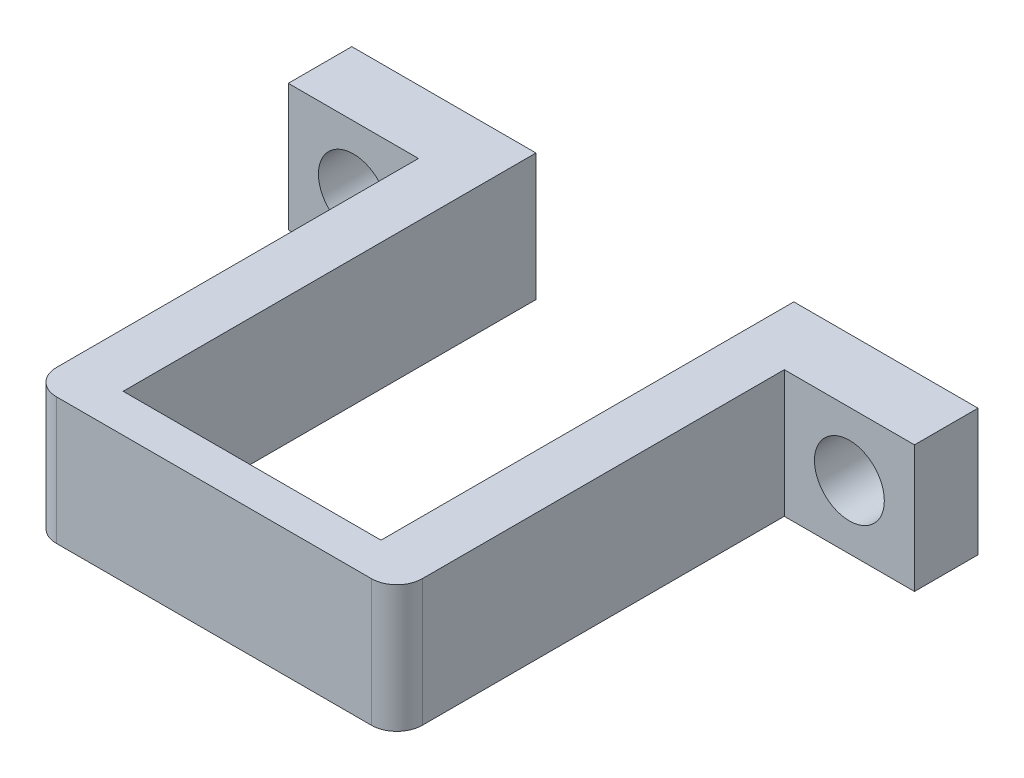
ISO-10303-21;
HEADER;
FILE_DESCRIPTION(('STEP AP214'),'2;1');
FILE_NAME('part.step','',(''),(''),'','','');
FILE_SCHEMA(('AUTOMOTIVE_DESIGN { 1 0 10303 214 1 1 1 1 }'));
ENDSEC;
DATA;
#1=APPLICATION_CONTEXT('core data for automotive mechanical design processes');
#2=APPLICATION_PROTOCOL_DEFINITION('international standard','automotive_design',2000,#1);
#3=PRODUCT_CONTEXT('',#1,'mechanical');
#4=PRODUCT('Part','Part','',(#3));
#5=PRODUCT_RELATED_PRODUCT_CATEGORY('part','',(#4));
#6=PRODUCT_DEFINITION_FORMATION('','',#4);
#7=PRODUCT_DEFINITION_CONTEXT('part definition',#1,'design');
#8=PRODUCT_DEFINITION('design','',#6,#7);
#9=PRODUCT_DEFINITION_SHAPE('','',#8);
#10=(LENGTH_UNIT() NAMED_UNIT(*) SI_UNIT(.MILLI.,.METRE.));
#11=(NAMED_UNIT(*) PLANE_ANGLE_UNIT() SI_UNIT($,.RADIAN.));
#12=(NAMED_UNIT(*) SI_UNIT($,.STERADIAN.) SOLID_ANGLE_UNIT());
#13=UNCERTAINTY_MEASURE_WITH_UNIT(LENGTH_MEASURE(1.E-05),#10,'distance_accuracy_value','');
#14=(GEOMETRIC_REPRESENTATION_CONTEXT(3) GLOBAL_UNCERTAINTY_ASSIGNED_CONTEXT((#13)) GLOBAL_UNIT_ASSIGNED_CONTEXT((#10,
#11,#12)) REPRESENTATION_CONTEXT('',''));
#15=CARTESIAN_POINT('',(0.,0.,0.));
#16=DIRECTION('',(0.,0.,1.));
#17=DIRECTION('',(1.,0.,0.));
#18=AXIS2_PLACEMENT_3D('',#15,#16,#17);
#19=CARTESIAN_POINT('',(-14.4,0.,35.5000000000006));
#20=DIRECTION('',(1.,0.,0.));
#21=DIRECTION('',(0.,0.,-1.));
#22=AXIS2_PLACEMENT_3D('',#19,#20,#21);
#23=PLANE('',#22);
#24=DIRECTION('',(0.,0.,-1.));
#25=VECTOR('',#24,1.);
#26=CARTESIAN_POINT('',(-14.4,-64.5,35.5000000000006));
#27=LINE('',#26,#25);
#28=CARTESIAN_POINT('',(-14.4,-64.5,33.5000000000006));
#29=VERTEX_POINT('',#28);
#30=CARTESIAN_POINT('',(-14.4,-64.5,5.));
#31=VERTEX_POINT('',#30);
#32=EDGE_CURVE('E225',#29,#31,#27,.T.);
#33=ORIENTED_EDGE('',*,*,#32,.F.);
#34=DIRECTION('',(0.,-1.,0.));
#35=VECTOR('',#34,1.);
#36=CARTESIAN_POINT('',(-14.4,-54.5,33.5000000000006));
#37=LINE('',#36,#35);
#38=CARTESIAN_POINT('',(-14.4,-54.5,33.5000000000006));
#39=VERTEX_POINT('',#38);
#40=EDGE_CURVE('E11',#29,#39,#37,.F.);
#41=ORIENTED_EDGE('',*,*,#40,.T.);
#42=DIRECTION('',(0.,0.,-1.));
#43=VECTOR('',#42,1.);
#44=CARTESIAN_POINT('',(-14.4,-54.5,35.5000000000006));
#45=LINE('',#44,#43);
#46=CARTESIAN_POINT('',(-14.4,-54.5,5.));
#47=VERTEX_POINT('',#46);
#48=EDGE_CURVE('E230',#39,#47,#45,.T.);
#49=ORIENTED_EDGE('',*,*,#48,.T.);
#50=DIRECTION('',(0.,1.,0.));
#51=VECTOR('',#50,1.);
#52=CARTESIAN_POINT('',(-14.4,-64.5,5.));
#53=LINE('',#52,#51);
#54=EDGE_CURVE('E180',#31,#47,#53,.T.);
#55=ORIENTED_EDGE('',*,*,#54,.F.);
#56=EDGE_LOOP('',(#33,#41,#49,#55));
#57=FACE_BOUND('',#56,.T.);
#58=ADVANCED_FACE('F35',(#57),#23,.F.);
#59=CARTESIAN_POINT('',(14.4,0.,43.365656906051));
#60=DIRECTION('',(-1.,0.,0.));
#61=DIRECTION('',(0.,0.,1.));
#62=AXIS2_PLACEMENT_3D('',#59,#60,#61);
#63=PLANE('',#62);
#64=DIRECTION('',(0.,0.,-1.));
#65=VECTOR('',#64,1.);
#66=CARTESIAN_POINT('',(14.4,-54.5,43.365656906051));
#67=LINE('',#66,#65);
#68=CARTESIAN_POINT('',(14.4,-54.5,33.5000000000006));
#69=VERTEX_POINT('',#68);
#70=CARTESIAN_POINT('',(14.4,-54.5,5.));
#71=VERTEX_POINT('',#70);
#72=EDGE_CURVE('E153',#69,#71,#67,.T.);
#73=ORIENTED_EDGE('',*,*,#72,.F.);
#74=DIRECTION('',(0.,1.,0.));
#75=VECTOR('',#74,1.);
#76=CARTESIAN_POINT('',(14.4,-64.5,33.5000000000006));
#77=LINE('',#76,#75);
#78=CARTESIAN_POINT('',(14.4,-64.5,33.5000000000006));
#79=VERTEX_POINT('',#78);
#80=EDGE_CURVE('E58',#69,#79,#77,.F.);
#81=ORIENTED_EDGE('',*,*,#80,.T.);
#82=DIRECTION('',(0.,0.,-1.));
#83=VECTOR('',#82,1.);
#84=CARTESIAN_POINT('',(14.4,-64.5,43.365656906051));
#85=LINE('',#84,#83);
#86=CARTESIAN_POINT('',(14.4,-64.5,5.));
#87=VERTEX_POINT('',#86);
#88=EDGE_CURVE('E244',#79,#87,#85,.T.);
#89=ORIENTED_EDGE('',*,*,#88,.T.);
#90=DIRECTION('',(0.,-1.,0.));
#91=VECTOR('',#90,1.);
#92=CARTESIAN_POINT('',(14.4,-54.5,5.));
#93=LINE('',#92,#91);
#94=EDGE_CURVE('E157',#71,#87,#93,.T.);
#95=ORIENTED_EDGE('',*,*,#94,.F.);
#96=EDGE_LOOP('',(#73,#81,#89,#95));
#97=FACE_BOUND('',#96,.T.);
#98=ADVANCED_FACE('F268',(#97),#63,.F.);
#99=CARTESIAN_POINT('',(0.,0.,32.5000000000006));
#100=DIRECTION('',(0.,0.,1.));
#101=DIRECTION('',(1.,0.,0.));
#102=AXIS2_PLACEMENT_3D('',#99,#100,#101);
#103=PLANE('',#102);
#104=DIRECTION('',(0.,-1.,0.));
#105=VECTOR('',#104,1.);
#106=CARTESIAN_POINT('',(-10.1499999999998,0.,32.5000000000006));
#107=LINE('',#106,#105);
#108=CARTESIAN_POINT('',(-10.1499999999998,-54.5,32.5000000000005));
#109=VERTEX_POINT('',#108);
#110=CARTESIAN_POINT('',(-10.1499999999998,-64.5,32.5000000000005));
#111=VERTEX_POINT('',#110);
#112=EDGE_CURVE('E204',#109,#111,#107,.T.);
#113=ORIENTED_EDGE('',*,*,#112,.F.);
#114=DIRECTION('',(-1.,0.,0.));
#115=VECTOR('',#114,1.);
#116=CARTESIAN_POINT('',(0.,-54.5,32.5000000000006));
#117=LINE('',#116,#115);
#118=CARTESIAN_POINT('',(10.1500000000002,-54.5,32.5000000000005));
#119=VERTEX_POINT('',#118);
#120=EDGE_CURVE('E222',#119,#109,#117,.T.);
#121=ORIENTED_EDGE('',*,*,#120,.F.);
#122=DIRECTION('',(0.,-1.,0.));
#123=VECTOR('',#122,1.);
#124=CARTESIAN_POINT('',(10.1500000000002,0.,32.5000000000006));
#125=LINE('',#124,#123);
#126=CARTESIAN_POINT('',(10.1500000000002,-64.5,32.5000000000006));
#127=VERTEX_POINT('',#126);
#128=EDGE_CURVE('E246',#119,#127,#125,.T.);
#129=ORIENTED_EDGE('',*,*,#128,.T.);
#130=DIRECTION('',(1.,0.,0.));
#131=VECTOR('',#130,1.);
#132=CARTESIAN_POINT('',(0.,-64.5,32.5000000000006));
#133=LINE('',#132,#131);
#134=EDGE_CURVE('E207',#111,#127,#133,.T.);
#135=ORIENTED_EDGE('',*,*,#134,.F.);
#136=EDGE_LOOP('',(#113,#121,#129,#135));
#137=FACE_BOUND('',#136,.T.);
#138=ADVANCED_FACE('F281',(#137),#103,.F.);
#139=CARTESIAN_POINT('',(0.,-64.5,43.365656906051));
#140=DIRECTION('',(0.,1.,0.));
#141=DIRECTION('',(0.,0.,1.));
#142=AXIS2_PLACEMENT_3D('',#139,#140,#141);
#143=PLANE('',#142);
#144=ORIENTED_EDGE('',*,*,#88,.F.);
#145=CARTESIAN_POINT('',(12.4,-64.5,33.5000000000006));
#146=DIRECTION('',(0.,1.,0.));
#147=DIRECTION('',(0.,0.,1.));
#148=AXIS2_PLACEMENT_3D('',#145,#146,#147);
#149=CIRCLE('',#148,2.);
#150=CARTESIAN_POINT('',(12.4,-64.5,35.5000000000006));
#151=VERTEX_POINT('',#150);
#152=EDGE_CURVE('E43',#79,#151,#149,.F.);
#153=ORIENTED_EDGE('',*,*,#152,.T.);
#154=DIRECTION('',(1.,0.,0.));
#155=VECTOR('',#154,1.);
#156=CARTESIAN_POINT('',(0.,-64.5,35.5000000000006));
#157=LINE('',#156,#155);
#158=CARTESIAN_POINT('',(-12.4,-64.5,35.5000000000006));
#159=VERTEX_POINT('',#158);
#160=EDGE_CURVE('E218',#159,#151,#157,.T.);
#161=ORIENTED_EDGE('',*,*,#160,.F.);
#162=CARTESIAN_POINT('',(-12.4,-64.5,33.5000000000006));
#163=DIRECTION('',(0.,1.,0.));
#164=DIRECTION('',(0.,0.,1.));
#165=AXIS2_PLACEMENT_3D('',#162,#163,#164);
#166=CIRCLE('',#165,2.);
#167=EDGE_CURVE('E50',#159,#29,#166,.F.);
#168=ORIENTED_EDGE('',*,*,#167,.T.);
#169=ORIENTED_EDGE('',*,*,#32,.T.);
#170=DIRECTION('',(1.,0.,0.));
#171=VECTOR('',#170,1.);
#172=CARTESIAN_POINT('',(-24.6499999999998,-64.5,5.));
#173=LINE('',#172,#171);
#174=CARTESIAN_POINT('',(-24.6499999999998,-64.5,5.));
#175=VERTEX_POINT('',#174);
#176=EDGE_CURVE('E177',#175,#31,#173,.T.);
#177=ORIENTED_EDGE('',*,*,#176,.F.);
#178=DIRECTION('',(0.,0.,-1.));
#179=VECTOR('',#178,1.);
#180=CARTESIAN_POINT('',(-24.6499999999998,-64.5,3.));
#181=LINE('',#180,#179);
#182=CARTESIAN_POINT('',(-24.6499999999998,-64.5,0.));
#183=VERTEX_POINT('',#182);
#184=EDGE_CURVE('E198',#175,#183,#181,.T.);
#185=ORIENTED_EDGE('',*,*,#184,.T.);
#186=DIRECTION('',(-1.,0.,0.));
#187=VECTOR('',#186,1.);
#188=CARTESIAN_POINT('',(0.,-64.5,0.));
#189=LINE('',#188,#187);
#190=CARTESIAN_POINT('',(-10.1499999999998,-64.5,0.));
#191=VERTEX_POINT('',#190);
#192=EDGE_CURVE('E201',#191,#183,#189,.T.);
#193=ORIENTED_EDGE('',*,*,#192,.F.);
#194=DIRECTION('',(0.,0.,-1.));
#195=VECTOR('',#194,1.);
#196=CARTESIAN_POINT('',(-10.1499999999998,-64.5,43.365656906051));
#197=LINE('',#196,#195);
#198=EDGE_CURVE('E208',#111,#191,#197,.T.);
#199=ORIENTED_EDGE('',*,*,#198,.F.);
#200=ORIENTED_EDGE('',*,*,#134,.T.);
#201=DIRECTION('',(0.,0.,-1.));
#202=VECTOR('',#201,1.);
#203=CARTESIAN_POINT('',(10.1500000000002,-64.5,43.365656906051));
#204=LINE('',#203,#202);
#205=CARTESIAN_POINT('',(10.1500000000002,-64.5,0.));
#206=VERTEX_POINT('',#205);
#207=EDGE_CURVE('E239',#127,#206,#204,.T.);
#208=ORIENTED_EDGE('',*,*,#207,.T.);
#209=DIRECTION('',(1.,0.,0.));
#210=VECTOR('',#209,1.);
#211=CARTESIAN_POINT('',(0.,-64.5,0.));
#212=LINE('',#211,#210);
#213=CARTESIAN_POINT('',(24.6500000000002,-64.5,0.));
#214=VERTEX_POINT('',#213);
#215=EDGE_CURVE('E232',#206,#214,#212,.T.);
#216=ORIENTED_EDGE('',*,*,#215,.T.);
#217=DIRECTION('',(0.,0.,-1.));
#218=VECTOR('',#217,1.);
#219=CARTESIAN_POINT('',(24.6500000000002,-64.5,3.));
#220=LINE('',#219,#218);
#221=CARTESIAN_POINT('',(24.6500000000002,-64.5,5.));
#222=VERTEX_POINT('',#221);
#223=EDGE_CURVE('E147',#222,#214,#220,.T.);
#224=ORIENTED_EDGE('',*,*,#223,.F.);
#225=DIRECTION('',(1.,0.,0.));
#226=VECTOR('',#225,1.);
#227=CARTESIAN_POINT('',(14.4,-64.5,5.));
#228=LINE('',#227,#226);
#229=EDGE_CURVE('E163',#87,#222,#228,.T.);
#230=ORIENTED_EDGE('',*,*,#229,.F.);
#231=EDGE_LOOP('',(#144,#153,#161,#168,#169,#177,#185,#193,#199,#200,#208,#216,#224,#230));
#232=FACE_BOUND('',#231,.T.);
#233=ADVANCED_FACE('F261',(#232),#143,.F.);
#234=CARTESIAN_POINT('',(0.,-54.5,43.365656906051));
#235=DIRECTION('',(0.,1.,0.));
#236=DIRECTION('',(0.,0.,1.));
#237=AXIS2_PLACEMENT_3D('',#234,#235,#236);
#238=PLANE('',#237);
#239=DIRECTION('',(-1.,0.,0.));
#240=VECTOR('',#239,1.);
#241=CARTESIAN_POINT('',(0.,-54.5,35.5000000000006));
#242=LINE('',#241,#240);
#243=CARTESIAN_POINT('',(12.4,-54.5,35.5000000000006));
#244=VERTEX_POINT('',#243);
#245=CARTESIAN_POINT('',(-12.4,-54.5,35.5000000000006));
#246=VERTEX_POINT('',#245);
#247=EDGE_CURVE('E221',#244,#246,#242,.T.);
#248=ORIENTED_EDGE('',*,*,#247,.F.);
#249=CARTESIAN_POINT('',(12.4,-54.5,33.5000000000006));
#250=DIRECTION('',(0.,1.,0.));
#251=DIRECTION('',(0.,0.,1.));
#252=AXIS2_PLACEMENT_3D('',#249,#250,#251);
#253=CIRCLE('',#252,2.);
#254=EDGE_CURVE('E257',#244,#69,#253,.T.);
#255=ORIENTED_EDGE('',*,*,#254,.T.);
#256=ORIENTED_EDGE('',*,*,#72,.T.);
#257=DIRECTION('',(-1.,0.,0.));
#258=VECTOR('',#257,1.);
#259=CARTESIAN_POINT('',(24.6500000000002,-54.5,5.));
#260=LINE('',#259,#258);
#261=CARTESIAN_POINT('',(24.6500000000002,-54.5,5.));
#262=VERTEX_POINT('',#261);
#263=EDGE_CURVE('E150',#262,#71,#260,.T.);
#264=ORIENTED_EDGE('',*,*,#263,.F.);
#265=DIRECTION('',(0.,0.,-1.));
#266=VECTOR('',#265,1.);
#267=CARTESIAN_POINT('',(24.6500000000002,-54.5,3.));
#268=LINE('',#267,#266);
#269=CARTESIAN_POINT('',(24.6500000000002,-54.5,0.));
#270=VERTEX_POINT('',#269);
#271=EDGE_CURVE('E137',#262,#270,#268,.T.);
#272=ORIENTED_EDGE('',*,*,#271,.T.);
#273=DIRECTION('',(1.,0.,0.));
#274=VECTOR('',#273,1.);
#275=CARTESIAN_POINT('',(0.,-54.5,0.));
#276=LINE('',#275,#274);
#277=CARTESIAN_POINT('',(10.1500000000002,-54.5,0.));
#278=VERTEX_POINT('',#277);
#279=EDGE_CURVE('E234',#278,#270,#276,.T.);
#280=ORIENTED_EDGE('',*,*,#279,.F.);
#281=DIRECTION('',(0.,0.,-1.));
#282=VECTOR('',#281,1.);
#283=CARTESIAN_POINT('',(10.1500000000002,-54.5,43.365656906051));
#284=LINE('',#283,#282);
#285=EDGE_CURVE('E241',#119,#278,#284,.T.);
#286=ORIENTED_EDGE('',*,*,#285,.F.);
#287=ORIENTED_EDGE('',*,*,#120,.T.);
#288=DIRECTION('',(0.,0.,-1.));
#289=VECTOR('',#288,1.);
#290=CARTESIAN_POINT('',(-10.1499999999998,-54.5,43.365656906051));
#291=LINE('',#290,#289);
#292=CARTESIAN_POINT('',(-10.1499999999998,-54.5,0.));
#293=VERTEX_POINT('',#292);
#294=EDGE_CURVE('E215',#109,#293,#291,.T.);
#295=ORIENTED_EDGE('',*,*,#294,.T.);
#296=DIRECTION('',(-1.,0.,0.));
#297=VECTOR('',#296,1.);
#298=CARTESIAN_POINT('',(0.,-54.5,0.));
#299=LINE('',#298,#297);
#300=CARTESIAN_POINT('',(-24.6499999999998,-54.5,0.));
#301=VERTEX_POINT('',#300);
#302=EDGE_CURVE('E213',#293,#301,#299,.T.);
#303=ORIENTED_EDGE('',*,*,#302,.T.);
#304=DIRECTION('',(0.,0.,-1.));
#305=VECTOR('',#304,1.);
#306=CARTESIAN_POINT('',(-24.6499999999998,-54.5,3.));
#307=LINE('',#306,#305);
#308=CARTESIAN_POINT('',(-24.6499999999998,-54.5,5.));
#309=VERTEX_POINT('',#308);
#310=EDGE_CURVE('E197',#309,#301,#307,.T.);
#311=ORIENTED_EDGE('',*,*,#310,.F.);
#312=DIRECTION('',(-1.,0.,0.));
#313=VECTOR('',#312,1.);
#314=CARTESIAN_POINT('',(-14.4,-54.5,5.));
#315=LINE('',#314,#313);
#316=EDGE_CURVE('E183',#47,#309,#315,.T.);
#317=ORIENTED_EDGE('',*,*,#316,.F.);
#318=ORIENTED_EDGE('',*,*,#48,.F.);
#319=CARTESIAN_POINT('',(-12.4,-54.5,33.5000000000006));
#320=DIRECTION('',(0.,1.,0.));
#321=DIRECTION('',(0.,0.,1.));
#322=AXIS2_PLACEMENT_3D('',#319,#320,#321);
#323=CIRCLE('',#322,2.);
#324=EDGE_CURVE('E255',#39,#246,#323,.T.);
#325=ORIENTED_EDGE('',*,*,#324,.T.);
#326=EDGE_LOOP('',(#248,#255,#256,#264,#272,#280,#286,#287,#295,#303,#311,#317,#318,#325));
#327=FACE_BOUND('',#326,.T.);
#328=ADVANCED_FACE('F152',(#327),#238,.T.);
#329=CARTESIAN_POINT('',(10.1500000000002,0.,43.365656906051));
#330=DIRECTION('',(-1.,0.,0.));
#331=DIRECTION('',(0.,0.,1.));
#332=AXIS2_PLACEMENT_3D('',#329,#330,#331);
#333=PLANE('',#332);
#334=DIRECTION('',(0.,1.,0.));
#335=VECTOR('',#334,1.);
#336=CARTESIAN_POINT('',(10.1500000000002,0.,0.));
#337=LINE('',#336,#335);
#338=EDGE_CURVE('E236',#206,#278,#337,.T.);
#339=ORIENTED_EDGE('',*,*,#338,.F.);
#340=ORIENTED_EDGE('',*,*,#207,.F.);
#341=ORIENTED_EDGE('',*,*,#128,.F.);
#342=ORIENTED_EDGE('',*,*,#285,.T.);
#343=EDGE_LOOP('',(#339,#340,#341,#342));
#344=FACE_BOUND('',#343,.T.);
#345=ADVANCED_FACE('F277',(#344),#333,.T.);
#346=CARTESIAN_POINT('',(0.,0.,0.));
#347=DIRECTION('',(0.,0.,1.));
#348=DIRECTION('',(1.,0.,0.));
#349=AXIS2_PLACEMENT_3D('',#346,#347,#348);
#350=PLANE('',#349);
#351=CARTESIAN_POINT('',(19.5250000000001,-59.5,0.));
#352=DIRECTION('',(0.,0.,-1.));
#353=DIRECTION('',(-1.,0.,0.));
#354=AXIS2_PLACEMENT_3D('',#351,#352,#353);
#355=CIRCLE('',#354,2.75);
#356=CARTESIAN_POINT('',(16.7750000000001,-59.5,0.));
#357=VERTEX_POINT('',#356);
#358=EDGE_CURVE('E186',#357,#357,#355,.T.);
#359=ORIENTED_EDGE('',*,*,#358,.F.);
#360=EDGE_LOOP('',(#359));
#361=FACE_BOUND('',#360,.T.);
#362=ORIENTED_EDGE('',*,*,#215,.F.);
#363=ORIENTED_EDGE('',*,*,#338,.T.);
#364=ORIENTED_EDGE('',*,*,#279,.T.);
#365=DIRECTION('',(0.,-1.,0.));
#366=VECTOR('',#365,1.);
#367=CARTESIAN_POINT('',(24.6500000000002,0.,0.));
#368=LINE('',#367,#366);
#369=EDGE_CURVE('E144',#270,#214,#368,.T.);
#370=ORIENTED_EDGE('',*,*,#369,.T.);
#371=EDGE_LOOP('',(#362,#363,#364,#370));
#372=FACE_BOUND('',#371,.T.);
#373=ADVANCED_FACE('F271',(#361,#372),#350,.F.);
#374=CARTESIAN_POINT('',(0.,0.,35.5000000000006));
#375=DIRECTION('',(0.,0.,1.));
#376=DIRECTION('',(1.,0.,0.));
#377=AXIS2_PLACEMENT_3D('',#374,#375,#376);
#378=PLANE('',#377);
#379=ORIENTED_EDGE('',*,*,#160,.T.);
#380=DIRECTION('',(0.,1.,0.));
#381=VECTOR('',#380,1.);
#382=CARTESIAN_POINT('',(12.4,-54.5,35.5000000000006));
#383=LINE('',#382,#381);
#384=EDGE_CURVE('E252',#151,#244,#383,.T.);
#385=ORIENTED_EDGE('',*,*,#384,.T.);
#386=ORIENTED_EDGE('',*,*,#247,.T.);
#387=DIRECTION('',(0.,-1.,0.));
#388=VECTOR('',#387,1.);
#389=CARTESIAN_POINT('',(-12.4,-64.5,35.5000000000006));
#390=LINE('',#389,#388);
#391=EDGE_CURVE('E249',#246,#159,#390,.T.);
#392=ORIENTED_EDGE('',*,*,#391,.T.);
#393=EDGE_LOOP('',(#379,#385,#386,#392));
#394=FACE_BOUND('',#393,.T.);
#395=ADVANCED_FACE('F265',(#394),#378,.T.);
#396=CARTESIAN_POINT('',(0.,0.,0.));
#397=DIRECTION('',(0.,0.,1.));
#398=DIRECTION('',(1.,0.,0.));
#399=AXIS2_PLACEMENT_3D('',#396,#397,#398);
#400=PLANE('',#399);
#401=CARTESIAN_POINT('',(-19.5249999999999,-59.5,0.));
#402=DIRECTION('',(0.,0.,-1.));
#403=DIRECTION('',(-1.,0.,0.));
#404=AXIS2_PLACEMENT_3D('',#401,#402,#403);
#405=CIRCLE('',#404,2.75);
#406=CARTESIAN_POINT('',(-22.2749999999999,-59.5,0.));
#407=VERTEX_POINT('',#406);
#408=EDGE_CURVE('E187',#407,#407,#405,.T.);
#409=ORIENTED_EDGE('',*,*,#408,.F.);
#410=EDGE_LOOP('',(#409));
#411=FACE_BOUND('',#410,.T.);
#412=ORIENTED_EDGE('',*,*,#192,.T.);
#413=DIRECTION('',(0.,-1.,0.));
#414=VECTOR('',#413,1.);
#415=CARTESIAN_POINT('',(-24.6499999999998,0.,0.));
#416=LINE('',#415,#414);
#417=EDGE_CURVE('E193',#301,#183,#416,.T.);
#418=ORIENTED_EDGE('',*,*,#417,.F.);
#419=ORIENTED_EDGE('',*,*,#302,.F.);
#420=DIRECTION('',(0.,1.,0.));
#421=VECTOR('',#420,1.);
#422=CARTESIAN_POINT('',(-10.1499999999998,0.,0.));
#423=LINE('',#422,#421);
#424=EDGE_CURVE('E210',#191,#293,#423,.T.);
#425=ORIENTED_EDGE('',*,*,#424,.F.);
#426=EDGE_LOOP('',(#412,#418,#419,#425));
#427=FACE_BOUND('',#426,.T.);
#428=ADVANCED_FACE('F292',(#411,#427),#400,.F.);
#429=CARTESIAN_POINT('',(-10.1499999999998,0.,43.365656906051));
#430=DIRECTION('',(-1.,0.,0.));
#431=DIRECTION('',(0.,0.,1.));
#432=AXIS2_PLACEMENT_3D('',#429,#430,#431);
#433=PLANE('',#432);
#434=ORIENTED_EDGE('',*,*,#424,.T.);
#435=ORIENTED_EDGE('',*,*,#294,.F.);
#436=ORIENTED_EDGE('',*,*,#112,.T.);
#437=ORIENTED_EDGE('',*,*,#198,.T.);
#438=EDGE_LOOP('',(#434,#435,#436,#437));
#439=FACE_BOUND('',#438,.T.);
#440=ADVANCED_FACE('F283',(#439),#433,.F.);
#441=CARTESIAN_POINT('',(-24.6499999999998,0.,3.));
#442=DIRECTION('',(1.,0.,0.));
#443=DIRECTION('',(0.,0.,-1.));
#444=AXIS2_PLACEMENT_3D('',#441,#442,#443);
#445=PLANE('',#444);
#446=ORIENTED_EDGE('',*,*,#417,.T.);
#447=ORIENTED_EDGE('',*,*,#184,.F.);
#448=DIRECTION('',(0.,-1.,0.));
#449=VECTOR('',#448,1.);
#450=CARTESIAN_POINT('',(-24.6499999999998,-54.5,5.));
#451=LINE('',#450,#449);
#452=EDGE_CURVE('E174',#309,#175,#451,.T.);
#453=ORIENTED_EDGE('',*,*,#452,.F.);
#454=ORIENTED_EDGE('',*,*,#310,.T.);
#455=EDGE_LOOP('',(#446,#447,#453,#454));
#456=FACE_BOUND('',#455,.T.);
#457=ADVANCED_FACE('F291',(#456),#445,.F.);
#458=CARTESIAN_POINT('',(24.6500000000002,0.,3.));
#459=DIRECTION('',(1.,0.,0.));
#460=DIRECTION('',(0.,0.,-1.));
#461=AXIS2_PLACEMENT_3D('',#458,#459,#460);
#462=PLANE('',#461);
#463=ORIENTED_EDGE('',*,*,#369,.F.);
#464=ORIENTED_EDGE('',*,*,#271,.F.);
#465=DIRECTION('',(0.,1.,0.));
#466=VECTOR('',#465,1.);
#467=CARTESIAN_POINT('',(24.6500000000002,-64.5,5.));
#468=LINE('',#467,#466);
#469=EDGE_CURVE('E142',#222,#262,#468,.T.);
#470=ORIENTED_EDGE('',*,*,#469,.F.);
#471=ORIENTED_EDGE('',*,*,#223,.T.);
#472=EDGE_LOOP('',(#463,#464,#470,#471));
#473=FACE_BOUND('',#472,.T.);
#474=ADVANCED_FACE('F139',(#473),#462,.T.);
#475=CARTESIAN_POINT('',(-19.5249999999999,-59.5,3.));
#476=DIRECTION('',(0.,0.,-1.));
#477=DIRECTION('',(-1.,0.,0.));
#478=AXIS2_PLACEMENT_3D('',#475,#476,#477);
#479=CYLINDRICAL_SURFACE('',#478,2.75);
#480=ORIENTED_EDGE('',*,*,#408,.T.);
#481=EDGE_LOOP('',(#480));
#482=FACE_BOUND('',#481,.T.);
#483=CARTESIAN_POINT('',(-19.5249999999999,-59.5,5.));
#484=DIRECTION('',(0.,0.,1.));
#485=DIRECTION('',(1.,0.,0.));
#486=AXIS2_PLACEMENT_3D('',#483,#484,#485);
#487=CIRCLE('',#486,2.75);
#488=CARTESIAN_POINT('',(-16.7749999999999,-59.5,5.));
#489=VERTEX_POINT('',#488);
#490=EDGE_CURVE('E171',#489,#489,#487,.T.);
#491=ORIENTED_EDGE('',*,*,#490,.T.);
#492=EDGE_LOOP('',(#491));
#493=FACE_BOUND('',#492,.T.);
#494=ADVANCED_FACE('F333',(#482,#493),#479,.F.);
#495=CARTESIAN_POINT('',(19.5250000000001,-59.5,3.));
#496=DIRECTION('',(0.,0.,-1.));
#497=DIRECTION('',(-1.,0.,0.));
#498=AXIS2_PLACEMENT_3D('',#495,#496,#497);
#499=CYLINDRICAL_SURFACE('',#498,2.75);
#500=ORIENTED_EDGE('',*,*,#358,.T.);
#501=EDGE_LOOP('',(#500));
#502=FACE_BOUND('',#501,.T.);
#503=CARTESIAN_POINT('',(19.5250000000001,-59.5,5.));
#504=DIRECTION('',(0.,0.,1.));
#505=DIRECTION('',(1.,0.,0.));
#506=AXIS2_PLACEMENT_3D('',#503,#504,#505);
#507=CIRCLE('',#506,2.75);
#508=CARTESIAN_POINT('',(22.2750000000001,-59.5,5.));
#509=VERTEX_POINT('',#508);
#510=EDGE_CURVE('E164',#509,#509,#507,.T.);
#511=ORIENTED_EDGE('',*,*,#510,.T.);
#512=EDGE_LOOP('',(#511));
#513=FACE_BOUND('',#512,.T.);
#514=ADVANCED_FACE('F330',(#502,#513),#499,.F.);
#515=CARTESIAN_POINT('',(0.,0.,5.));
#516=DIRECTION('',(0.,0.,1.));
#517=DIRECTION('',(1.,0.,0.));
#518=AXIS2_PLACEMENT_3D('',#515,#516,#517);
#519=PLANE('',#518);
#520=ORIENTED_EDGE('',*,*,#452,.T.);
#521=ORIENTED_EDGE('',*,*,#176,.T.);
#522=ORIENTED_EDGE('',*,*,#54,.T.);
#523=ORIENTED_EDGE('',*,*,#316,.T.);
#524=EDGE_LOOP('',(#520,#521,#522,#523));
#525=FACE_BOUND('',#524,.T.);
#526=ORIENTED_EDGE('',*,*,#490,.F.);
#527=EDGE_LOOP('',(#526));
#528=FACE_BOUND('',#527,.T.);
#529=ADVANCED_FACE('F297',(#525,#528),#519,.T.);
#530=CARTESIAN_POINT('',(0.,0.,5.));
#531=DIRECTION('',(0.,0.,1.));
#532=DIRECTION('',(1.,0.,0.));
#533=AXIS2_PLACEMENT_3D('',#530,#531,#532);
#534=PLANE('',#533);
#535=ORIENTED_EDGE('',*,*,#469,.T.);
#536=ORIENTED_EDGE('',*,*,#263,.T.);
#537=ORIENTED_EDGE('',*,*,#94,.T.);
#538=ORIENTED_EDGE('',*,*,#229,.T.);
#539=EDGE_LOOP('',(#535,#536,#537,#538));
#540=FACE_BOUND('',#539,.T.);
#541=ORIENTED_EDGE('',*,*,#510,.F.);
#542=EDGE_LOOP('',(#541));
#543=FACE_BOUND('',#542,.T.);
#544=ADVANCED_FACE('F160',(#540,#543),#534,.T.);
#545=CARTESIAN_POINT('',(12.4,0.,33.5000000000006));
#546=DIRECTION('',(0.,-1.,0.));
#547=DIRECTION('',(0.,0.,-1.));
#548=AXIS2_PLACEMENT_3D('',#545,#546,#547);
#549=CYLINDRICAL_SURFACE('',#548,2.);
#550=ORIENTED_EDGE('',*,*,#152,.F.);
#551=ORIENTED_EDGE('',*,*,#80,.F.);
#552=ORIENTED_EDGE('',*,*,#254,.F.);
#553=ORIENTED_EDGE('',*,*,#384,.F.);
#554=EDGE_LOOP('',(#550,#551,#552,#553));
#555=FACE_BOUND('',#554,.T.);
#556=ADVANCED_FACE('F267',(#555),#549,.T.);
#557=CARTESIAN_POINT('',(-12.4,0.,33.5000000000006));
#558=DIRECTION('',(0.,1.,0.));
#559=DIRECTION('',(0.,0.,1.));
#560=AXIS2_PLACEMENT_3D('',#557,#558,#559);
#561=CYLINDRICAL_SURFACE('',#560,2.);
#562=ORIENTED_EDGE('',*,*,#324,.F.);
#563=ORIENTED_EDGE('',*,*,#40,.F.);
#564=ORIENTED_EDGE('',*,*,#167,.F.);
#565=ORIENTED_EDGE('',*,*,#391,.F.);
#566=EDGE_LOOP('',(#562,#563,#564,#565));
#567=FACE_BOUND('',#566,.T.);
#568=ADVANCED_FACE('F37',(#567),#561,.T.);
#569=CLOSED_SHELL('',(#58,#98,#138,#233,#328,#345,#373,#395,#428,#440,#457,#474,#494,#514,#529,
#544,#556,#568));
#570=MANIFOLD_SOLID_BREP('B2',#569);
#571=ADVANCED_BREP_SHAPE_REPRESENTATION('',(#18,#570),#14);
#572=SHAPE_DEFINITION_REPRESENTATION(#9,#571);
ENDSEC;
END-ISO-10303-21;
